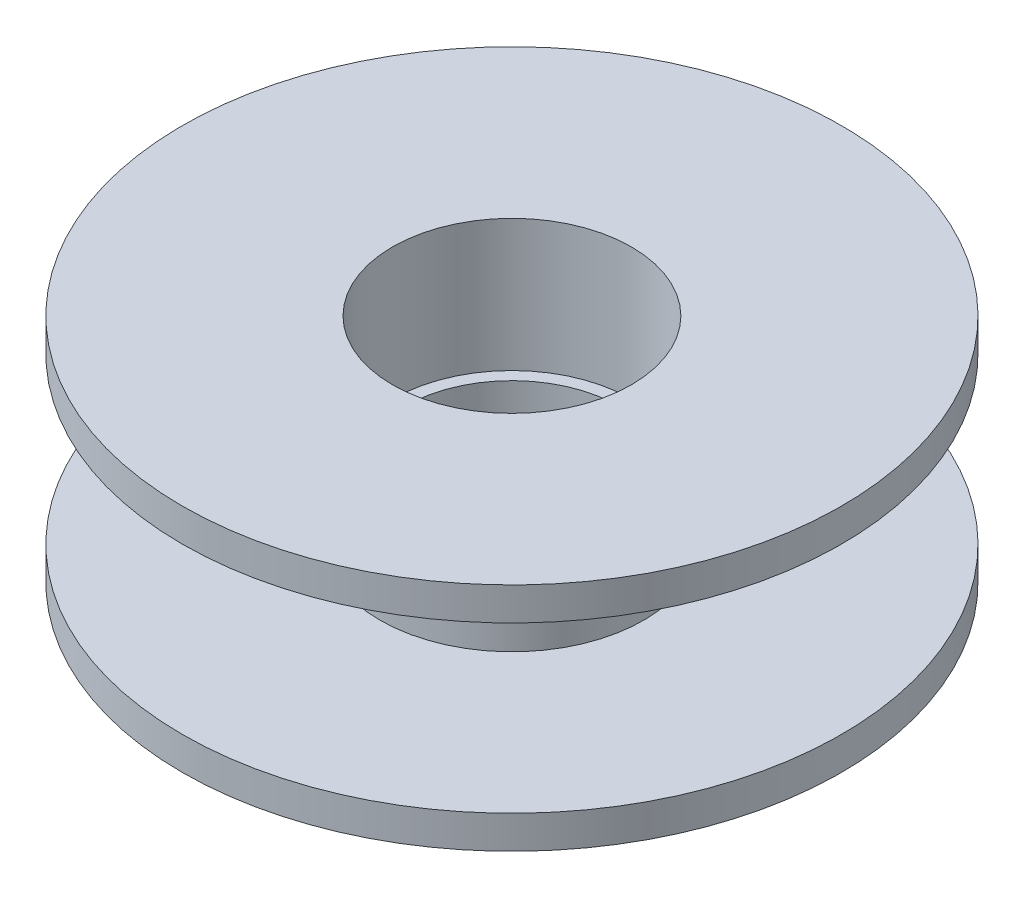
ISO-10303-21;
HEADER;
FILE_DESCRIPTION(('STEP AP214'),'2;1');
FILE_NAME('part.step','',(''),(''),'','','');
FILE_SCHEMA(('AUTOMOTIVE_DESIGN { 1 0 10303 214 1 1 1 1 }'));
ENDSEC;
DATA;
#1=APPLICATION_CONTEXT('core data for automotive mechanical design processes');
#2=APPLICATION_PROTOCOL_DEFINITION('international standard','automotive_design',2000,#1);
#3=PRODUCT_CONTEXT('',#1,'mechanical');
#4=PRODUCT('Part','Part','',(#3));
#5=PRODUCT_RELATED_PRODUCT_CATEGORY('part','',(#4));
#6=PRODUCT_DEFINITION_FORMATION('','',#4);
#7=PRODUCT_DEFINITION_CONTEXT('part definition',#1,'design');
#8=PRODUCT_DEFINITION('design','',#6,#7);
#9=PRODUCT_DEFINITION_SHAPE('','',#8);
#10=(LENGTH_UNIT() NAMED_UNIT(*) SI_UNIT(.MILLI.,.METRE.));
#11=(NAMED_UNIT(*) PLANE_ANGLE_UNIT() SI_UNIT($,.RADIAN.));
#12=(NAMED_UNIT(*) SI_UNIT($,.STERADIAN.) SOLID_ANGLE_UNIT());
#13=UNCERTAINTY_MEASURE_WITH_UNIT(LENGTH_MEASURE(1.E-05),#10,'distance_accuracy_value','');
#14=(GEOMETRIC_REPRESENTATION_CONTEXT(3) GLOBAL_UNCERTAINTY_ASSIGNED_CONTEXT((#13)) GLOBAL_UNIT_ASSIGNED_CONTEXT((#10,
#11,#12)) REPRESENTATION_CONTEXT('',''));
#15=CARTESIAN_POINT('',(0.,0.,0.));
#16=DIRECTION('',(0.,0.,1.));
#17=DIRECTION('',(1.,0.,0.));
#18=AXIS2_PLACEMENT_3D('',#15,#16,#17);
#19=CARTESIAN_POINT('',(0.,28.0586262240942,0.));
#20=DIRECTION('',(0.,1.,0.));
#21=DIRECTION('',(0.,0.,1.));
#22=AXIS2_PLACEMENT_3D('',#19,#20,#21);
#23=CYLINDRICAL_SURFACE('',#22,14.5);
#24=CARTESIAN_POINT('',(0.,17.8386588718912,0.));
#25=DIRECTION('',(0.,1.,0.));
#26=DIRECTION('',(0.,0.,1.));
#27=AXIS2_PLACEMENT_3D('',#24,#25,#26);
#28=CIRCLE('',#27,14.5);
#29=CARTESIAN_POINT('',(0.,17.8386588718912,14.5));
#30=VERTEX_POINT('',#29);
#31=EDGE_CURVE('E10',#30,#30,#28,.T.);
#32=ORIENTED_EDGE('',*,*,#31,.F.);
#33=EDGE_LOOP('',(#32));
#34=FACE_BOUND('',#33,.T.);
#35=CARTESIAN_POINT('',(0.,33.8386588718912,0.));
#36=DIRECTION('',(0.,1.,0.));
#37=DIRECTION('',(0.,0.,1.));
#38=AXIS2_PLACEMENT_3D('',#35,#36,#37);
#39=CIRCLE('',#38,14.5);
#40=CARTESIAN_POINT('',(0.,33.8386588718912,14.5));
#41=VERTEX_POINT('',#40);
#42=EDGE_CURVE('E40',#41,#41,#39,.F.);
#43=ORIENTED_EDGE('',*,*,#42,.F.);
#44=EDGE_LOOP('',(#43));
#45=FACE_BOUND('',#44,.T.);
#46=ADVANCED_FACE('F37',(#34,#45),#23,.F.);
#47=CARTESIAN_POINT('',(0.,17.8386588718912,13.));
#48=DIRECTION('',(0.,1.,0.));
#49=DIRECTION('',(0.,0.,1.));
#50=AXIS2_PLACEMENT_3D('',#47,#48,#49);
#51=PLANE('',#50);
#52=ORIENTED_EDGE('',*,*,#31,.T.);
#53=EDGE_LOOP('',(#52));
#54=FACE_BOUND('',#53,.T.);
#55=CARTESIAN_POINT('',(0.,17.8386588718912,0.));
#56=DIRECTION('',(0.,1.,0.));
#57=DIRECTION('',(0.,0.,1.));
#58=AXIS2_PLACEMENT_3D('',#55,#56,#57);
#59=CIRCLE('',#58,13.);
#60=CARTESIAN_POINT('',(0.,17.8386588718912,13.));
#61=VERTEX_POINT('',#60);
#62=EDGE_CURVE('E45',#61,#61,#59,.T.);
#63=ORIENTED_EDGE('',*,*,#62,.F.);
#64=EDGE_LOOP('',(#63));
#65=FACE_BOUND('',#64,.T.);
#66=ADVANCED_FACE('F89',(#54,#65),#51,.T.);
#67=CARTESIAN_POINT('',(0.,28.0586262240942,0.));
#68=DIRECTION('',(0.,1.,0.));
#69=DIRECTION('',(0.,0.,1.));
#70=AXIS2_PLACEMENT_3D('',#67,#68,#69);
#71=CYLINDRICAL_SURFACE('',#70,13.);
#72=ORIENTED_EDGE('',*,*,#62,.T.);
#73=EDGE_LOOP('',(#72));
#74=FACE_BOUND('',#73,.T.);
#75=CARTESIAN_POINT('',(0.,5.83865887189124,0.));
#76=DIRECTION('',(0.,1.,0.));
#77=DIRECTION('',(0.,0.,1.));
#78=AXIS2_PLACEMENT_3D('',#75,#76,#77);
#79=CIRCLE('',#78,13.);
#80=CARTESIAN_POINT('',(0.,5.83865887189124,13.));
#81=VERTEX_POINT('',#80);
#82=EDGE_CURVE('E50',#81,#81,#79,.T.);
#83=ORIENTED_EDGE('',*,*,#82,.F.);
#84=EDGE_LOOP('',(#83));
#85=FACE_BOUND('',#84,.T.);
#86=ADVANCED_FACE('F94',(#74,#85),#71,.F.);
#87=CARTESIAN_POINT('',(0.,5.83865887189124,40.));
#88=DIRECTION('',(0.,-1.,0.));
#89=DIRECTION('',(0.,0.,-1.));
#90=AXIS2_PLACEMENT_3D('',#87,#88,#89);
#91=PLANE('',#90);
#92=ORIENTED_EDGE('',*,*,#82,.T.);
#93=EDGE_LOOP('',(#92));
#94=FACE_BOUND('',#93,.T.);
#95=CARTESIAN_POINT('',(0.,5.83865887189124,0.));
#96=DIRECTION('',(0.,1.,0.));
#97=DIRECTION('',(0.,0.,1.));
#98=AXIS2_PLACEMENT_3D('',#95,#96,#97);
#99=CIRCLE('',#98,40.);
#100=CARTESIAN_POINT('',(0.,5.83865887189124,40.));
#101=VERTEX_POINT('',#100);
#102=EDGE_CURVE('E56',#101,#101,#99,.T.);
#103=ORIENTED_EDGE('',*,*,#102,.F.);
#104=EDGE_LOOP('',(#103));
#105=FACE_BOUND('',#104,.T.);
#106=ADVANCED_FACE('F98',(#94,#105),#91,.T.);
#107=CARTESIAN_POINT('',(0.,28.0586262240942,0.));
#108=DIRECTION('',(0.,1.,0.));
#109=DIRECTION('',(0.,0.,1.));
#110=AXIS2_PLACEMENT_3D('',#107,#108,#109);
#111=CYLINDRICAL_SURFACE('',#110,40.);
#112=ORIENTED_EDGE('',*,*,#102,.T.);
#113=EDGE_LOOP('',(#112));
#114=FACE_BOUND('',#113,.T.);
#115=CARTESIAN_POINT('',(0.,9.83865887189124,0.));
#116=DIRECTION('',(0.,1.,0.));
#117=DIRECTION('',(0.,0.,1.));
#118=AXIS2_PLACEMENT_3D('',#115,#116,#117);
#119=CIRCLE('',#118,40.);
#120=CARTESIAN_POINT('',(0.,9.83865887189124,40.));
#121=VERTEX_POINT('',#120);
#122=EDGE_CURVE('E60',#121,#121,#119,.T.);
#123=ORIENTED_EDGE('',*,*,#122,.F.);
#124=EDGE_LOOP('',(#123));
#125=FACE_BOUND('',#124,.T.);
#126=ADVANCED_FACE('F105',(#114,#125),#111,.T.);
#127=CARTESIAN_POINT('',(0.,9.83865887189124,16.));
#128=DIRECTION('',(0.,1.,0.));
#129=DIRECTION('',(0.,0.,1.));
#130=AXIS2_PLACEMENT_3D('',#127,#128,#129);
#131=PLANE('',#130);
#132=ORIENTED_EDGE('',*,*,#122,.T.);
#133=EDGE_LOOP('',(#132));
#134=FACE_BOUND('',#133,.T.);
#135=CARTESIAN_POINT('',(0.,9.83865887189124,0.));
#136=DIRECTION('',(0.,1.,0.));
#137=DIRECTION('',(0.,0.,1.));
#138=AXIS2_PLACEMENT_3D('',#135,#136,#137);
#139=CIRCLE('',#138,16.);
#140=CARTESIAN_POINT('',(0.,9.83865887189124,16.));
#141=VERTEX_POINT('',#140);
#142=EDGE_CURVE('E64',#141,#141,#139,.T.);
#143=ORIENTED_EDGE('',*,*,#142,.F.);
#144=EDGE_LOOP('',(#143));
#145=FACE_BOUND('',#144,.T.);
#146=ADVANCED_FACE('F109',(#134,#145),#131,.T.);
#147=CARTESIAN_POINT('',(0.,28.0586262240942,0.));
#148=DIRECTION('',(0.,1.,0.));
#149=DIRECTION('',(0.,0.,1.));
#150=AXIS2_PLACEMENT_3D('',#147,#148,#149);
#151=CYLINDRICAL_SURFACE('',#150,16.);
#152=ORIENTED_EDGE('',*,*,#142,.T.);
#153=EDGE_LOOP('',(#152));
#154=FACE_BOUND('',#153,.T.);
#155=CARTESIAN_POINT('',(0.,29.8386588718912,0.));
#156=DIRECTION('',(0.,1.,0.));
#157=DIRECTION('',(0.,0.,1.));
#158=AXIS2_PLACEMENT_3D('',#155,#156,#157);
#159=CIRCLE('',#158,16.);
#160=CARTESIAN_POINT('',(0.,29.8386588718912,16.));
#161=VERTEX_POINT('',#160);
#162=EDGE_CURVE('E68',#161,#161,#159,.T.);
#163=ORIENTED_EDGE('',*,*,#162,.F.);
#164=EDGE_LOOP('',(#163));
#165=FACE_BOUND('',#164,.T.);
#166=ADVANCED_FACE('F113',(#154,#165),#151,.T.);
#167=CARTESIAN_POINT('',(0.,33.8386588718912,40.));
#168=DIRECTION('',(0.,1.,0.));
#169=DIRECTION('',(0.,0.,-1.));
#170=AXIS2_PLACEMENT_3D('',#167,#168,#169);
#171=PLANE('',#170);
#172=ORIENTED_EDGE('',*,*,#42,.T.);
#173=EDGE_LOOP('',(#172));
#174=FACE_BOUND('',#173,.T.);
#175=CARTESIAN_POINT('',(0.,33.8386588718912,0.));
#176=DIRECTION('',(0.,1.,0.));
#177=DIRECTION('',(0.,0.,1.));
#178=AXIS2_PLACEMENT_3D('',#175,#176,#177);
#179=CIRCLE('',#178,40.);
#180=CARTESIAN_POINT('',(0.,33.8386588718912,40.));
#181=VERTEX_POINT('',#180);
#182=EDGE_CURVE('E72',#181,#181,#179,.T.);
#183=ORIENTED_EDGE('',*,*,#182,.T.);
#184=EDGE_LOOP('',(#183));
#185=FACE_BOUND('',#184,.T.);
#186=ADVANCED_FACE('F85',(#174,#185),#171,.T.);
#187=CARTESIAN_POINT('',(0.,11.6186915196882,0.));
#188=DIRECTION('',(0.,-1.,0.));
#189=DIRECTION('',(0.,0.,1.));
#190=AXIS2_PLACEMENT_3D('',#187,#188,#189);
#191=CYLINDRICAL_SURFACE('',#190,40.);
#192=ORIENTED_EDGE('',*,*,#182,.F.);
#193=EDGE_LOOP('',(#192));
#194=FACE_BOUND('',#193,.T.);
#195=CARTESIAN_POINT('',(0.,29.8386588718912,0.));
#196=DIRECTION('',(0.,1.,0.));
#197=DIRECTION('',(0.,0.,1.));
#198=AXIS2_PLACEMENT_3D('',#195,#196,#197);
#199=CIRCLE('',#198,40.);
#200=CARTESIAN_POINT('',(0.,29.8386588718912,40.));
#201=VERTEX_POINT('',#200);
#202=EDGE_CURVE('E76',#201,#201,#199,.T.);
#203=ORIENTED_EDGE('',*,*,#202,.T.);
#204=EDGE_LOOP('',(#203));
#205=FACE_BOUND('',#204,.T.);
#206=ADVANCED_FACE('F120',(#194,#205),#191,.T.);
#207=CARTESIAN_POINT('',(0.,29.8386588718912,16.));
#208=DIRECTION('',(0.,-1.,0.));
#209=DIRECTION('',(0.,0.,1.));
#210=AXIS2_PLACEMENT_3D('',#207,#208,#209);
#211=PLANE('',#210);
#212=ORIENTED_EDGE('',*,*,#202,.F.);
#213=EDGE_LOOP('',(#212));
#214=FACE_BOUND('',#213,.T.);
#215=ORIENTED_EDGE('',*,*,#162,.T.);
#216=EDGE_LOOP('',(#215));
#217=FACE_BOUND('',#216,.T.);
#218=ADVANCED_FACE('F123',(#214,#217),#211,.T.);
#219=CLOSED_SHELL('',(#46,#66,#86,#106,#126,#146,#166,#186,#206,#218));
#220=MANIFOLD_SOLID_BREP('B2',#219);
#221=ADVANCED_BREP_SHAPE_REPRESENTATION('',(#18,#220),#14);
#222=SHAPE_DEFINITION_REPRESENTATION(#9,#221);
ENDSEC;
END-ISO-10303-21;
